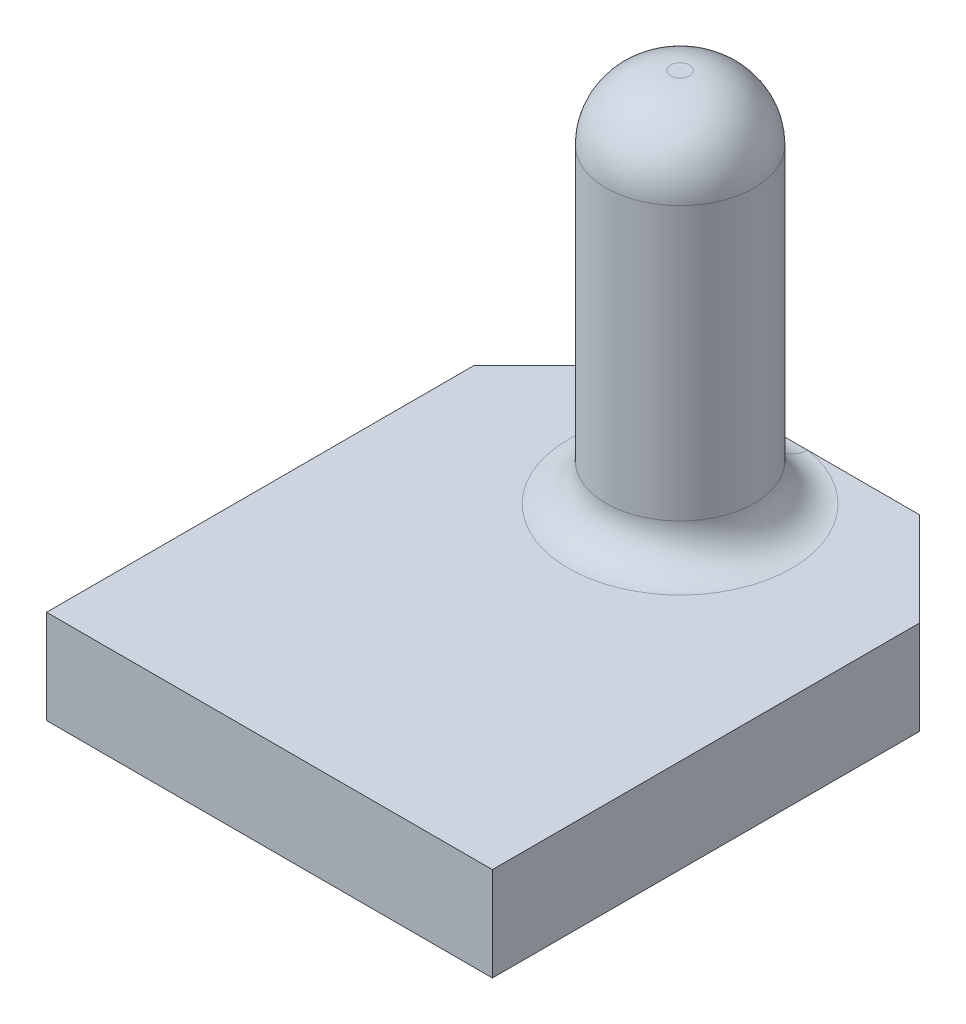
ISO-10303-21;
HEADER;
FILE_DESCRIPTION(('STEP AP214'),'2;1');
FILE_NAME('part.step','',(''),(''),'','','');
FILE_SCHEMA(('AUTOMOTIVE_DESIGN { 1 0 10303 214 1 1 1 1 }'));
ENDSEC;
DATA;
#1=APPLICATION_CONTEXT('core data for automotive mechanical design processes');
#2=APPLICATION_PROTOCOL_DEFINITION('international standard','automotive_design',2000,#1);
#3=PRODUCT_CONTEXT('',#1,'mechanical');
#4=PRODUCT('Part','Part','',(#3));
#5=PRODUCT_RELATED_PRODUCT_CATEGORY('part','',(#4));
#6=PRODUCT_DEFINITION_FORMATION('','',#4);
#7=PRODUCT_DEFINITION_CONTEXT('part definition',#1,'design');
#8=PRODUCT_DEFINITION('design','',#6,#7);
#9=PRODUCT_DEFINITION_SHAPE('','',#8);
#10=(LENGTH_UNIT() NAMED_UNIT(*) SI_UNIT(.MILLI.,.METRE.));
#11=(NAMED_UNIT(*) PLANE_ANGLE_UNIT() SI_UNIT($,.RADIAN.));
#12=(NAMED_UNIT(*) SI_UNIT($,.STERADIAN.) SOLID_ANGLE_UNIT());
#13=UNCERTAINTY_MEASURE_WITH_UNIT(LENGTH_MEASURE(1.E-05),#10,'distance_accuracy_value','');
#14=(GEOMETRIC_REPRESENTATION_CONTEXT(3) GLOBAL_UNCERTAINTY_ASSIGNED_CONTEXT((#13)) GLOBAL_UNIT_ASSIGNED_CONTEXT((#10,
#11,#12)) REPRESENTATION_CONTEXT('',''));
#15=CARTESIAN_POINT('',(0.,0.,0.));
#16=DIRECTION('',(0.,0.,1.));
#17=DIRECTION('',(1.,0.,0.));
#18=AXIS2_PLACEMENT_3D('',#15,#16,#17);
#19=CARTESIAN_POINT('',(11.875,5.,13.875));
#20=DIRECTION('',(-1.,0.,0.));
#21=DIRECTION('',(0.,0.,1.));
#22=AXIS2_PLACEMENT_3D('',#19,#20,#21);
#23=PLANE('',#22);
#24=DIRECTION('',(0.,0.,-1.));
#25=VECTOR('',#24,1.);
#26=CARTESIAN_POINT('',(11.875,0.,13.875));
#27=LINE('',#26,#25);
#28=CARTESIAN_POINT('',(11.875,0.,13.875));
#29=VERTEX_POINT('',#28);
#30=CARTESIAN_POINT('',(11.875,0.,-8.87499999999998));
#31=VERTEX_POINT('',#30);
#32=EDGE_CURVE('E136',#29,#31,#27,.T.);
#33=ORIENTED_EDGE('',*,*,#32,.T.);
#34=DIRECTION('',(0.,1.,0.));
#35=VECTOR('',#34,1.);
#36=CARTESIAN_POINT('',(11.875,5.,-8.87499999999998));
#37=LINE('',#36,#35);
#38=CARTESIAN_POINT('',(11.875,5.,-8.87499999999998));
#39=VERTEX_POINT('',#38);
#40=EDGE_CURVE('E11',#31,#39,#37,.T.);
#41=ORIENTED_EDGE('',*,*,#40,.T.);
#42=DIRECTION('',(0.,0.,-1.));
#43=VECTOR('',#42,1.);
#44=CARTESIAN_POINT('',(11.875,5.,13.875));
#45=LINE('',#44,#43);
#46=CARTESIAN_POINT('',(11.875,5.,13.875));
#47=VERTEX_POINT('',#46);
#48=EDGE_CURVE('E144',#47,#39,#45,.T.);
#49=ORIENTED_EDGE('',*,*,#48,.F.);
#50=DIRECTION('',(0.,-1.,0.));
#51=VECTOR('',#50,1.);
#52=CARTESIAN_POINT('',(11.875,5.,13.875));
#53=LINE('',#52,#51);
#54=EDGE_CURVE('E128',#47,#29,#53,.T.);
#55=ORIENTED_EDGE('',*,*,#54,.T.);
#56=EDGE_LOOP('',(#33,#41,#49,#55));
#57=FACE_BOUND('',#56,.T.);
#58=ADVANCED_FACE('F43',(#57),#23,.F.);
#59=CARTESIAN_POINT('',(-11.875,5.,-13.875));
#60=DIRECTION('',(0.,0.,1.));
#61=DIRECTION('',(1.,0.,0.));
#62=AXIS2_PLACEMENT_3D('',#59,#60,#61);
#63=PLANE('',#62);
#64=DIRECTION('',(-1.,0.,0.));
#65=VECTOR('',#64,1.);
#66=CARTESIAN_POINT('',(-11.875,0.,-13.875));
#67=LINE('',#66,#65);
#68=CARTESIAN_POINT('',(6.87500000000001,0.,-13.875));
#69=VERTEX_POINT('',#68);
#70=CARTESIAN_POINT('',(-6.87499999999999,0.,-13.875));
#71=VERTEX_POINT('',#70);
#72=EDGE_CURVE('E138',#69,#71,#67,.T.);
#73=ORIENTED_EDGE('',*,*,#72,.T.);
#74=DIRECTION('',(0.,1.,0.));
#75=VECTOR('',#74,1.);
#76=CARTESIAN_POINT('',(-6.87499999999999,5.,-13.875));
#77=LINE('',#76,#75);
#78=CARTESIAN_POINT('',(-6.87499999999999,5.,-13.875));
#79=VERTEX_POINT('',#78);
#80=EDGE_CURVE('E306',#71,#79,#77,.T.);
#81=ORIENTED_EDGE('',*,*,#80,.T.);
#82=DIRECTION('',(-1.,0.,0.));
#83=VECTOR('',#82,1.);
#84=CARTESIAN_POINT('',(-11.875,5.,-13.875));
#85=LINE('',#84,#83);
#86=CARTESIAN_POINT('',(-0.94174041009186,5.,-13.875));
#87=VERTEX_POINT('',#86);
#88=EDGE_CURVE('E301',#87,#79,#85,.T.);
#89=ORIENTED_EDGE('',*,*,#88,.F.);
#90=CARTESIAN_POINT('',(0.94174041009186,5.,-13.875));
#91=VERTEX_POINT('',#90);
#92=EDGE_CURVE('E299',#91,#87,#85,.T.);
#93=ORIENTED_EDGE('',*,*,#92,.F.);
#94=CARTESIAN_POINT('',(6.87500000000001,5.,-13.875));
#95=VERTEX_POINT('',#94);
#96=EDGE_CURVE('E118',#95,#91,#85,.T.);
#97=ORIENTED_EDGE('',*,*,#96,.F.);
#98=DIRECTION('',(0.,-1.,0.));
#99=VECTOR('',#98,1.);
#100=CARTESIAN_POINT('',(6.87500000000001,5.,-13.875));
#101=LINE('',#100,#99);
#102=EDGE_CURVE('E305',#95,#69,#101,.T.);
#103=ORIENTED_EDGE('',*,*,#102,.T.);
#104=EDGE_LOOP('',(#73,#81,#89,#93,#97,#103));
#105=FACE_BOUND('',#104,.T.);
#106=ADVANCED_FACE('F212',(#105),#63,.F.);
#107=CARTESIAN_POINT('',(-11.875,5.,13.875));
#108=DIRECTION('',(1.,0.,0.));
#109=DIRECTION('',(0.,0.,-1.));
#110=AXIS2_PLACEMENT_3D('',#107,#108,#109);
#111=PLANE('',#110);
#112=DIRECTION('',(0.,0.,1.));
#113=VECTOR('',#112,1.);
#114=CARTESIAN_POINT('',(-11.875,5.,13.875));
#115=LINE('',#114,#113);
#116=CARTESIAN_POINT('',(-11.875,5.,-8.87500000000001));
#117=VERTEX_POINT('',#116);
#118=CARTESIAN_POINT('',(-11.875,5.,13.875));
#119=VERTEX_POINT('',#118);
#120=EDGE_CURVE('E107',#117,#119,#115,.T.);
#121=ORIENTED_EDGE('',*,*,#120,.F.);
#122=DIRECTION('',(0.,-1.,0.));
#123=VECTOR('',#122,1.);
#124=CARTESIAN_POINT('',(-11.875,5.,-8.87500000000001));
#125=LINE('',#124,#123);
#126=CARTESIAN_POINT('',(-11.875,0.,-8.87500000000001));
#127=VERTEX_POINT('',#126);
#128=EDGE_CURVE('E194',#117,#127,#125,.T.);
#129=ORIENTED_EDGE('',*,*,#128,.T.);
#130=DIRECTION('',(0.,0.,1.));
#131=VECTOR('',#130,1.);
#132=CARTESIAN_POINT('',(-11.875,0.,13.875));
#133=LINE('',#132,#131);
#134=CARTESIAN_POINT('',(-11.875,0.,13.875));
#135=VERTEX_POINT('',#134);
#136=EDGE_CURVE('E124',#127,#135,#133,.T.);
#137=ORIENTED_EDGE('',*,*,#136,.T.);
#138=DIRECTION('',(0.,-1.,0.));
#139=VECTOR('',#138,1.);
#140=CARTESIAN_POINT('',(-11.875,5.,13.875));
#141=LINE('',#140,#139);
#142=EDGE_CURVE('E121',#119,#135,#141,.T.);
#143=ORIENTED_EDGE('',*,*,#142,.F.);
#144=EDGE_LOOP('',(#121,#129,#137,#143));
#145=FACE_BOUND('',#144,.T.);
#146=ADVANCED_FACE('F122',(#145),#111,.F.);
#147=CARTESIAN_POINT('',(-11.875,5.,13.875));
#148=DIRECTION('',(0.,0.,-1.));
#149=DIRECTION('',(-1.,0.,0.));
#150=AXIS2_PLACEMENT_3D('',#147,#148,#149);
#151=PLANE('',#150);
#152=DIRECTION('',(1.,0.,0.));
#153=VECTOR('',#152,1.);
#154=CARTESIAN_POINT('',(-11.875,0.,13.875));
#155=LINE('',#154,#153);
#156=EDGE_CURVE('E143',#135,#29,#155,.T.);
#157=ORIENTED_EDGE('',*,*,#156,.T.);
#158=ORIENTED_EDGE('',*,*,#54,.F.);
#159=DIRECTION('',(1.,0.,0.));
#160=VECTOR('',#159,1.);
#161=CARTESIAN_POINT('',(-11.875,5.,13.875));
#162=LINE('',#161,#160);
#163=EDGE_CURVE('E112',#119,#47,#162,.T.);
#164=ORIENTED_EDGE('',*,*,#163,.F.);
#165=ORIENTED_EDGE('',*,*,#142,.T.);
#166=EDGE_LOOP('',(#157,#158,#164,#165));
#167=FACE_BOUND('',#166,.T.);
#168=ADVANCED_FACE('F130',(#167),#151,.F.);
#169=CARTESIAN_POINT('',(0.,5.,0.));
#170=DIRECTION('',(0.,-1.,0.));
#171=DIRECTION('',(0.,0.,-1.));
#172=AXIS2_PLACEMENT_3D('',#169,#170,#171);
#173=PLANE('',#172);
#174=ORIENTED_EDGE('',*,*,#88,.T.);
#175=DIRECTION('',(0.707106781186549,0.,-0.707106781186547));
#176=VECTOR('',#175,1.);
#177=CARTESIAN_POINT('',(-11.875,5.,-8.87500000000001));
#178=LINE('',#177,#176);
#179=EDGE_CURVE('E52',#79,#117,#178,.F.);
#180=ORIENTED_EDGE('',*,*,#179,.T.);
#181=ORIENTED_EDGE('',*,*,#120,.T.);
#182=ORIENTED_EDGE('',*,*,#163,.T.);
#183=ORIENTED_EDGE('',*,*,#48,.T.);
#184=DIRECTION('',(0.707106781186546,0.,0.707106781186549));
#185=VECTOR('',#184,1.);
#186=CARTESIAN_POINT('',(6.87500000000001,5.,-13.875));
#187=LINE('',#186,#185);
#188=EDGE_CURVE('E64',#39,#95,#187,.F.);
#189=ORIENTED_EDGE('',*,*,#188,.T.);
#190=ORIENTED_EDGE('',*,*,#96,.T.);
#191=CARTESIAN_POINT('',(0.,5.,-8.));
#192=DIRECTION('',(0.,-1.,0.));
#193=DIRECTION('',(0.,0.,-1.));
#194=AXIS2_PLACEMENT_3D('',#191,#192,#193);
#195=CIRCLE('',#194,5.95);
#196=EDGE_CURVE('E162',#91,#87,#195,.T.);
#197=ORIENTED_EDGE('',*,*,#196,.T.);
#198=EDGE_LOOP('',(#174,#180,#181,#182,#183,#189,#190,#197));
#199=FACE_BOUND('',#198,.T.);
#200=ADVANCED_FACE('F110',(#199),#173,.F.);
#201=CARTESIAN_POINT('',(0.,0.,0.));
#202=DIRECTION('',(0.,-1.,0.));
#203=DIRECTION('',(0.,0.,-1.));
#204=AXIS2_PLACEMENT_3D('',#201,#202,#203);
#205=PLANE('',#204);
#206=ORIENTED_EDGE('',*,*,#136,.F.);
#207=DIRECTION('',(-0.707106781186549,0.,0.707106781186547));
#208=VECTOR('',#207,1.);
#209=CARTESIAN_POINT('',(-10.375,0.,-10.375));
#210=LINE('',#209,#208);
#211=EDGE_CURVE('E311',#127,#71,#210,.F.);
#212=ORIENTED_EDGE('',*,*,#211,.T.);
#213=ORIENTED_EDGE('',*,*,#72,.F.);
#214=DIRECTION('',(-0.707106781186546,0.,-0.707106781186549));
#215=VECTOR('',#214,1.);
#216=CARTESIAN_POINT('',(10.375,0.,-10.375));
#217=LINE('',#216,#215);
#218=EDGE_CURVE('E312',#69,#31,#217,.F.);
#219=ORIENTED_EDGE('',*,*,#218,.T.);
#220=ORIENTED_EDGE('',*,*,#32,.F.);
#221=ORIENTED_EDGE('',*,*,#156,.F.);
#222=EDGE_LOOP('',(#206,#212,#213,#219,#220,#221));
#223=FACE_BOUND('',#222,.T.);
#224=ADVANCED_FACE('F223',(#223),#205,.T.);
#225=CARTESIAN_POINT('',(0.,25.,-8.));
#226=DIRECTION('',(0.,-1.,0.));
#227=DIRECTION('',(0.,0.,-1.));
#228=AXIS2_PLACEMENT_3D('',#225,#226,#227);
#229=CYLINDRICAL_SURFACE('',#228,3.95);
#230=CARTESIAN_POINT('',(0.,7.,-8.));
#231=DIRECTION('',(0.,-1.,0.));
#232=DIRECTION('',(0.,0.,-1.));
#233=AXIS2_PLACEMENT_3D('',#230,#231,#232);
#234=CIRCLE('',#233,3.95);
#235=CARTESIAN_POINT('',(-0.625189011741655,7.,-11.9002100840336));
#236=VERTEX_POINT('',#235);
#237=CARTESIAN_POINT('',(0.625189011741655,7.,-11.9002100840336));
#238=VERTEX_POINT('',#237);
#239=EDGE_CURVE('E151',#236,#238,#234,.F.);
#240=ORIENTED_EDGE('',*,*,#239,.T.);
#241=CARTESIAN_POINT('',(1.53050169006895,6.96164679516457,-11.6414371581418));
#242=CARTESIAN_POINT('',(1.36076939016843,4.57034626097767,-11.7127759072608));
#243=CARTESIAN_POINT('',(2.30543925466082,5.,-13.875));
#244=CARTESIAN_POINT('',(1.48158300460447,6.96779390109386,-11.6619986475371));
#245=CARTESIAN_POINT('',(1.33278243601276,4.60737958647044,-11.7218977358061));
#246=CARTESIAN_POINT('',(2.23175161452192,5.,-13.875));
#247=CARTESIAN_POINT('',(1.43221184552606,6.97290350872281,-11.6815884547281));
#248=CARTESIAN_POINT('',(1.30152856582844,4.64232919478607,-11.7321929191556));
#249=CARTESIAN_POINT('',(2.15738240021702,5.,-13.875));
#250=CARTESIAN_POINT('',(1.33267176922052,6.98144314836983,-11.7187776576585));
#251=CARTESIAN_POINT('',(1.23381418687742,4.70744547984949,-11.7539585008105));
#252=CARTESIAN_POINT('',(2.00744228528788,5.,-13.875));
#253=CARTESIAN_POINT('',(1.28250299862953,6.98487348550816,-11.7363774145389));
#254=CARTESIAN_POINT('',(1.19738237617799,4.7377257719435,-11.765426863285));
#255=CARTESIAN_POINT('',(1.93187160554592,5.,-13.875));
#256=CARTESIAN_POINT('',(1.13101284067651,6.99323683511533,-11.7861058934016));
#257=CARTESIAN_POINT('',(1.08229211280292,4.8211202476652,-11.7999288371654));
#258=CARTESIAN_POINT('',(1.70367757015737,5.,-13.875));
#259=CARTESIAN_POINT('',(1.02863102613744,6.99625053313701,-11.8151960161524));
#260=CARTESIAN_POINT('',(0.996318260832994,4.86847611492295,-11.8235977539001));
#261=CARTESIAN_POINT('',(1.54945686216286,5.,-13.875));
#262=CARTESIAN_POINT('',(0.82447035577066,6.99960614728282,-11.8643887473936));
#263=CARTESIAN_POINT('',(0.815039138607493,4.94586922838323,-11.8660714960783));
#264=CARTESIAN_POINT('',(1.24192370045837,5.,-13.875));
#265=CARTESIAN_POINT('',(0.722741495117046,7.00001357417123,-11.8846996534062));
#266=CARTESIAN_POINT('',(0.719751150842671,4.97679982645334,-11.8851703855837));
#267=CARTESIAN_POINT('',(1.08868655593411,5.,-13.875));
#268=CARTESIAN_POINT('',(0.517988703455294,6.99998575346423,-11.9172609062288));
#269=CARTESIAN_POINT('',(0.52253243489614,5.02519746886763,-11.9165430850874));
#270=CARTESIAN_POINT('',(0.78026146470017,5.,-13.875));
#271=CARTESIAN_POINT('',(0.414964641529029,6.99955041999159,-11.9295104314141));
#272=CARTESIAN_POINT('',(0.420102903725144,5.04296620889305,-11.9289898654874));
#273=CARTESIAN_POINT('',(0.625073320784691,5.,-13.875));
#274=CARTESIAN_POINT('',(0.206213362562508,6.99884873312505,-11.9460303202092));
#275=CARTESIAN_POINT('',(0.210340552346186,5.06662980210427,-11.9458192072689));
#276=CARTESIAN_POINT('',(0.310625191707616,5.,-13.875));
#277=CARTESIAN_POINT('',(0.100473152128987,6.99858591494243,-11.9501370425112));
#278=CARTESIAN_POINT('',(0.102305476000305,5.07243207960994,-11.9501411882996));
#279=CARTESIAN_POINT('',(0.151345634219489,5.,-13.875));
#280=CARTESIAN_POINT('',(-0.110992481984468,6.99860099226305,-11.9498559539244));
#281=CARTESIAN_POINT('',(-0.113028426188587,5.07203461840136,-11.9498515368595));
#282=CARTESIAN_POINT('',(-0.16719120703977,5.,-13.875));
#283=CARTESIAN_POINT('',(-0.216717905531267,6.99887889235614,-11.9454680709297));
#284=CARTESIAN_POINT('',(-0.221001156330082,5.06583229207546,-11.9452379977118));
#285=CARTESIAN_POINT('',(-0.326448490610355,5.,-13.875));
#286=CARTESIAN_POINT('',(-0.430255081481649,6.99960759831694,-11.9279958060119));
#287=CARTESIAN_POINT('',(-0.435403492960876,5.0407788529233,-11.9274502411586));
#288=CARTESIAN_POINT('',(-0.648105755649607,5.,-13.875));
#289=CARTESIAN_POINT('',(-0.538048829660861,7.00006274776311,-11.9146863627795));
#290=CARTESIAN_POINT('',(-0.542379244398583,5.02143473020195,-11.9139400368094));
#291=CARTESIAN_POINT('',(-0.810478616830925,5.,-13.875));
#292=CARTESIAN_POINT('',(-0.698622952781542,6.99995967694798,-11.8881066364999));
#293=CARTESIAN_POINT('',(-0.695779792486603,4.98190450958226,-11.8885921791466));
#294=CARTESIAN_POINT('',(-1.05235609343042,5.,-13.875));
#295=CARTESIAN_POINT('',(-0.751969779468752,6.99979426739182,-11.8781420716075));
#296=CARTESIAN_POINT('',(-0.746100878660888,4.96684169453878,-11.8792153931648));
#297=CARTESIAN_POINT('',(-1.13271397160483,5.,-13.875));
#298=CARTESIAN_POINT('',(-0.858206833231929,6.99896053763323,-11.8560244171546));
#299=CARTESIAN_POINT('',(-0.844068846901832,4.93289763612209,-11.8591175660032));
#300=CARTESIAN_POINT('',(-1.29274193866582,5.,-13.875));
#301=CARTESIAN_POINT('',(-0.911097052590524,6.99829220894746,-11.8438712906798));
#302=CARTESIAN_POINT('',(-0.891772322981574,4.91395703789395,-11.8483690593193));
#303=CARTESIAN_POINT('',(-1.3724120159275,5.,-13.875));
#304=CARTESIAN_POINT('',(-0.96371874042932,6.99725200756799,-11.8306326095497));
#305=CARTESIAN_POINT('',(-0.937593131539536,4.89306593338415,-11.8372053460813));
#306=CARTESIAN_POINT('',(-1.4516775963429,5.,-13.875));
#307=(BOUNDED_SURFACE() B_SPLINE_SURFACE(3,2,((#241,#242,#243),(#244,#245,#246),(#247,#248,
#249),(#250,#251,#252),(#253,#254,#255),(#256,#257,#258),(#259,#260,#261),(#262,#263,#264),
(#265,#266,#267),(#268,#269,#270),(#271,#272,#273),(#274,#275,#276),(#277,#278,#279),(#280,#281,
#282),(#283,#284,#285),(#286,#287,#288),(#289,#290,#291),(#292,#293,#294),(#295,#296,#297),
(#298,#299,#300),(#301,#302,#303),(#304,#305,#306)),.UNSPECIFIED.,.F.,.F.,
.F.) B_SPLINE_SURFACE_WITH_KNOTS((4,2,2,2,2,2,2,2,2,2,4),(3,3),(0.,0.240449943020466,
0.48085618051423,0.961293746290322,1.42960604256209,1.89796606234513,2.37564672632531,
2.8533314450825,3.34354420130904,3.58872678361972,3.83391350181491),(0.,1.),
.UNSPECIFIED.) GEOMETRIC_REPRESENTATION_ITEM() RATIONAL_B_SPLINE_SURFACE(((1.,0.640439822186455,
1.),(1.,0.645617196698053,1.),(1.,0.650580503473475,1.),(1.,0.660048938736722,1.),(1.,
0.664554150341615,1.),(1.,0.677333661911925,1.),(1.,0.684880001443973,1.),(1.,0.697701007575124,
1.),(1.,0.703028199910372,1.),(1.,0.71159039553581,1.),(1.,0.714825185565498,1.),(1.,
0.719191198053565,1.),(1.,0.720279277174465,1.),(1.,0.720204897908382,1.),(1.,0.719042420417704,
1.),(1.,0.714425100764005,1.),(1.,0.710910937301905,1.),(1.,0.70392577328601,1.),(1.,
0.701311192657049,1.),(1.,0.695523642029179,1.),(1.,0.692350662611772,1.),(1.,0.68890504362287,1.))) REPRESENTATION_ITEM('') SURFACE());
#308=CARTESIAN_POINT('',(1.53050169006895,6.96164679516457,-11.6414371581418));
#309=CARTESIAN_POINT('',(1.48158300460447,6.96779390109386,-11.6619986475371));
#310=CARTESIAN_POINT('',(1.43221184552606,6.97290350872281,-11.6815884547281));
#311=CARTESIAN_POINT('',(1.33267176922052,6.98144314836983,-11.7187776576585));
#312=CARTESIAN_POINT('',(1.28250299862953,6.98487348550816,-11.7363774145389));
#313=CARTESIAN_POINT('',(1.13101284067651,6.99323683511533,-11.7861058934016));
#314=CARTESIAN_POINT('',(1.02863102613744,6.99625053313701,-11.8151960161524));
#315=CARTESIAN_POINT('',(0.82447035577066,6.99960614728282,-11.8643887473936));
#316=CARTESIAN_POINT('',(0.722741495117046,7.00001357417123,-11.8846996534062));
#317=CARTESIAN_POINT('',(0.517988703455294,6.99998575346423,-11.9172609062288));
#318=CARTESIAN_POINT('',(0.414964641529029,6.99955041999159,-11.9295104314141));
#319=CARTESIAN_POINT('',(0.206213362562508,6.99884873312504,-11.9460303202092));
#320=CARTESIAN_POINT('',(0.100473152128987,6.99858591494242,-11.9501370425112));
#321=CARTESIAN_POINT('',(-0.110992481984468,6.99860099226305,-11.9498559539244));
#322=CARTESIAN_POINT('',(-0.216717905531267,6.99887889235614,-11.9454680709297));
#323=CARTESIAN_POINT('',(-0.430255081481649,6.99960759831694,-11.9279958060119));
#324=CARTESIAN_POINT('',(-0.538048829660861,7.00006274776311,-11.9146863627795));
#325=CARTESIAN_POINT('',(-0.698622952781542,6.99995967694798,-11.8881066364999));
#326=CARTESIAN_POINT('',(-0.751969779468752,6.99979426739182,-11.8781420716075));
#327=CARTESIAN_POINT('',(-0.858206833231929,6.99896053763323,-11.8560244171546));
#328=CARTESIAN_POINT('',(-0.911097052590524,6.99829220894746,-11.8438712906798));
#329=CARTESIAN_POINT('',(-0.96371874042932,6.99725200756799,-11.8306326095497));
#330=B_SPLINE_CURVE_WITH_KNOTS('',3,(#308,#309,#310,#311,#312,#313,#314,#315,#316,#317,#318,
#319,#320,#321,#322,#323,#324,#325,#326,#327,#328,#329),.UNSPECIFIED.,.F.,.F.,(4,2,2,2,2,2,2,2,
2,2,4),(0.,0.240449943020466,0.48085618051423,0.961293746290322,1.42960604256209,
1.89796606234513,2.37564672632531,2.8533314450825,3.34354420130904,3.58872678361972,
3.83391350181491),.UNSPECIFIED.);
#331=EDGE_CURVE('E153',#238,#236,#330,.T.);
#332=ORIENTED_EDGE('',*,*,#331,.T.);
#333=EDGE_LOOP('',(#240,#332));
#334=FACE_BOUND('',#333,.T.);
#335=CARTESIAN_POINT('',(0.,21.55,-8.));
#336=DIRECTION('',(0.,1.,0.));
#337=DIRECTION('',(0.,0.,1.));
#338=AXIS2_PLACEMENT_3D('',#335,#336,#337);
#339=CIRCLE('',#338,3.95);
#340=CARTESIAN_POINT('',(0.,21.55,-4.05));
#341=VERTEX_POINT('',#340);
#342=EDGE_CURVE('E148',#341,#341,#339,.F.);
#343=ORIENTED_EDGE('',*,*,#342,.T.);
#344=EDGE_LOOP('',(#343));
#345=FACE_BOUND('',#344,.T.);
#346=ADVANCED_FACE('F164',(#334,#345),#229,.T.);
#347=CARTESIAN_POINT('',(0.,25.,-8.));
#348=DIRECTION('',(0.,1.,0.));
#349=DIRECTION('',(0.,0.,1.));
#350=AXIS2_PLACEMENT_3D('',#347,#348,#349);
#351=PLANE('',#350);
#352=CARTESIAN_POINT('',(0.,25.,-8.));
#353=DIRECTION('',(0.,1.,0.));
#354=DIRECTION('',(0.,0.,1.));
#355=AXIS2_PLACEMENT_3D('',#352,#353,#354);
#356=CIRCLE('',#355,0.5);
#357=CARTESIAN_POINT('',(0.,25.,-7.5));
#358=VERTEX_POINT('',#357);
#359=EDGE_CURVE('E127',#358,#358,#356,.T.);
#360=ORIENTED_EDGE('',*,*,#359,.T.);
#361=EDGE_LOOP('',(#360));
#362=FACE_BOUND('',#361,.T.);
#363=ADVANCED_FACE('F243',(#362),#351,.T.);
#364=CARTESIAN_POINT('',(0.,21.55,-8.));
#365=DIRECTION('',(0.,1.,0.));
#366=DIRECTION('',(0.,0.,1.));
#367=AXIS2_PLACEMENT_3D('',#364,#365,#366);
#368=DEGENERATE_TOROIDAL_SURFACE('',#367,0.5,3.45,.T.);
#369=ORIENTED_EDGE('',*,*,#342,.F.);
#370=EDGE_LOOP('',(#369));
#371=FACE_BOUND('',#370,.T.);
#372=ORIENTED_EDGE('',*,*,#359,.F.);
#373=EDGE_LOOP('',(#372));
#374=FACE_BOUND('',#373,.T.);
#375=ADVANCED_FACE('F171',(#371,#374),#368,.T.);
#376=CARTESIAN_POINT('',(0.,7.,-8.));
#377=DIRECTION('',(0.,-1.,0.));
#378=DIRECTION('',(0.,0.,-1.));
#379=AXIS2_PLACEMENT_3D('',#376,#377,#378);
#380=TOROIDAL_SURFACE('',#379,5.95,2.);
#381=CARTESIAN_POINT('',(-0.94174041009186,7.,-13.875));
#382=DIRECTION('',(-0.987394957983193,0.,0.158275699175103));
#383=DIRECTION('',(0.158275699175103,0.,0.987394957983194));
#384=AXIS2_PLACEMENT_3D('',#381,#382,#383);
#385=CIRCLE('',#384,2.);
#386=EDGE_CURVE('E298',#87,#236,#385,.T.);
#387=ORIENTED_EDGE('',*,*,#386,.F.);
#388=ORIENTED_EDGE('',*,*,#196,.F.);
#389=CARTESIAN_POINT('',(0.94174041009186,7.,-13.875));
#390=DIRECTION('',(0.987394957983194,0.,0.158275699175103));
#391=DIRECTION('',(0.158275699175103,0.,-0.987394957983193));
#392=AXIS2_PLACEMENT_3D('',#389,#390,#391);
#393=CIRCLE('',#392,2.);
#394=EDGE_CURVE('E139',#238,#91,#393,.T.);
#395=ORIENTED_EDGE('',*,*,#394,.F.);
#396=ORIENTED_EDGE('',*,*,#239,.F.);
#397=EDGE_LOOP('',(#387,#388,#395,#396));
#398=FACE_BOUND('',#397,.T.);
#399=ADVANCED_FACE('F179',(#398),#380,.F.);
#400=ORIENTED_EDGE('',*,*,#394,.T.);
#401=ORIENTED_EDGE('',*,*,#92,.T.);
#402=ORIENTED_EDGE('',*,*,#386,.T.);
#403=ORIENTED_EDGE('',*,*,#331,.F.);
#404=EDGE_LOOP('',(#400,#401,#402,#403));
#405=FACE_BOUND('',#404,.T.);
#406=ADVANCED_FACE('F173',(#405),#307,.F.);
#407=CARTESIAN_POINT('',(-11.875,5.,-8.87500000000001));
#408=DIRECTION('',(0.707106781186546,0.,0.707106781186548));
#409=DIRECTION('',(0.,-1.,0.));
#410=AXIS2_PLACEMENT_3D('',#407,#408,#409);
#411=PLANE('',#410);
#412=ORIENTED_EDGE('',*,*,#179,.F.);
#413=ORIENTED_EDGE('',*,*,#80,.F.);
#414=ORIENTED_EDGE('',*,*,#211,.F.);
#415=ORIENTED_EDGE('',*,*,#128,.F.);
#416=EDGE_LOOP('',(#412,#413,#414,#415));
#417=FACE_BOUND('',#416,.T.);
#418=ADVANCED_FACE('F178',(#417),#411,.F.);
#419=CARTESIAN_POINT('',(6.87500000000001,5.,-13.875));
#420=DIRECTION('',(-0.707106781186549,0.,0.707106781186546));
#421=DIRECTION('',(0.,-1.,0.));
#422=AXIS2_PLACEMENT_3D('',#419,#420,#421);
#423=PLANE('',#422);
#424=ORIENTED_EDGE('',*,*,#188,.F.);
#425=ORIENTED_EDGE('',*,*,#40,.F.);
#426=ORIENTED_EDGE('',*,*,#218,.F.);
#427=ORIENTED_EDGE('',*,*,#102,.F.);
#428=EDGE_LOOP('',(#424,#425,#426,#427));
#429=FACE_BOUND('',#428,.T.);
#430=ADVANCED_FACE('F46',(#429),#423,.F.);
#431=CLOSED_SHELL('',(#58,#106,#146,#168,#200,#224,#346,#363,#375,#399,#406,#418,#430));
#432=MANIFOLD_SOLID_BREP('B2',#431);
#433=ADVANCED_BREP_SHAPE_REPRESENTATION('',(#18,#432),#14);
#434=SHAPE_DEFINITION_REPRESENTATION(#9,#433);
ENDSEC;
END-ISO-10303-21;
